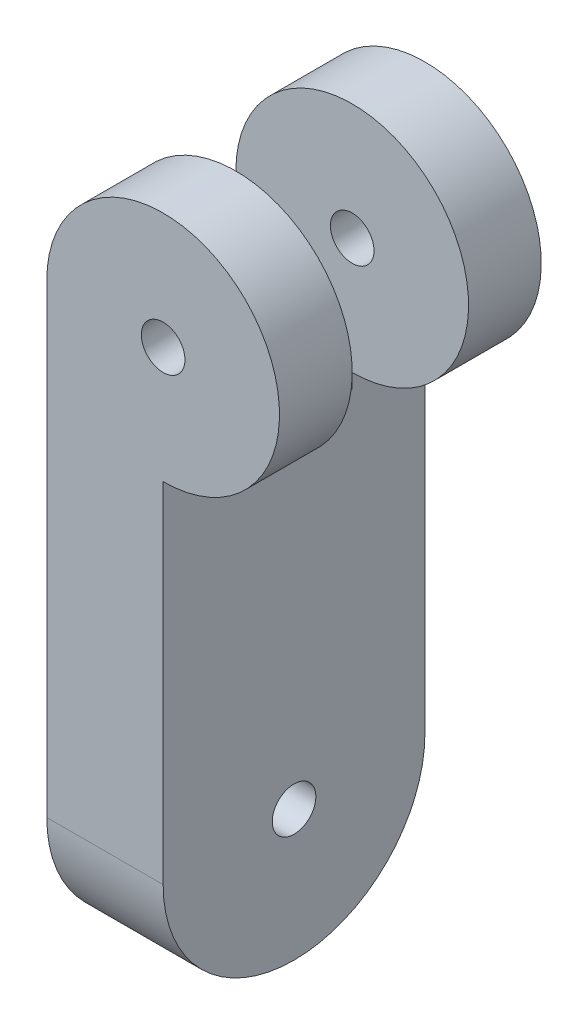
ISO-10303-21;
HEADER;
FILE_DESCRIPTION(('STEP AP214'),'2;1');
FILE_NAME('part.step','',(''),(''),'','','');
FILE_SCHEMA(('AUTOMOTIVE_DESIGN { 1 0 10303 214 1 1 1 1 }'));
ENDSEC;
DATA;
#1=APPLICATION_CONTEXT('core data for automotive mechanical design processes');
#2=APPLICATION_PROTOCOL_DEFINITION('international standard','automotive_design',2000,#1);
#3=PRODUCT_CONTEXT('',#1,'mechanical');
#4=PRODUCT('Part','Part','',(#3));
#5=PRODUCT_RELATED_PRODUCT_CATEGORY('part','',(#4));
#6=PRODUCT_DEFINITION_FORMATION('','',#4);
#7=PRODUCT_DEFINITION_CONTEXT('part definition',#1,'design');
#8=PRODUCT_DEFINITION('design','',#6,#7);
#9=PRODUCT_DEFINITION_SHAPE('','',#8);
#10=(LENGTH_UNIT() NAMED_UNIT(*) SI_UNIT(.MILLI.,.METRE.));
#11=(NAMED_UNIT(*) PLANE_ANGLE_UNIT() SI_UNIT($,.RADIAN.));
#12=(NAMED_UNIT(*) SI_UNIT($,.STERADIAN.) SOLID_ANGLE_UNIT());
#13=UNCERTAINTY_MEASURE_WITH_UNIT(LENGTH_MEASURE(1.E-05),#10,'distance_accuracy_value','');
#14=(GEOMETRIC_REPRESENTATION_CONTEXT(3) GLOBAL_UNCERTAINTY_ASSIGNED_CONTEXT((#13)) GLOBAL_UNIT_ASSIGNED_CONTEXT((#10,
#11,#12)) REPRESENTATION_CONTEXT('',''));
#15=CARTESIAN_POINT('',(0.,0.,0.));
#16=DIRECTION('',(0.,0.,1.));
#17=DIRECTION('',(1.,0.,0.));
#18=AXIS2_PLACEMENT_3D('',#15,#16,#17);
#19=CARTESIAN_POINT('',(0.,0.,0.));
#20=DIRECTION('',(1.,0.,0.));
#21=DIRECTION('',(0.,0.,-1.));
#22=AXIS2_PLACEMENT_3D('',#19,#20,#21);
#23=PLANE('',#22);
#24=CARTESIAN_POINT('',(0.,0.,0.));
#25=DIRECTION('',(1.,0.,0.));
#26=DIRECTION('',(0.,0.,-1.));
#27=AXIS2_PLACEMENT_3D('',#24,#25,#26);
#28=CIRCLE('',#27,3.);
#29=CARTESIAN_POINT('',(0.,0.,-3.));
#30=VERTEX_POINT('',#29);
#31=EDGE_CURVE('E165',#30,#30,#28,.T.);
#32=ORIENTED_EDGE('',*,*,#31,.T.);
#33=EDGE_LOOP('',(#32));
#34=FACE_BOUND('',#33,.T.);
#35=DIRECTION('',(0.,-1.,0.));
#36=VECTOR('',#35,1.);
#37=CARTESIAN_POINT('',(0.,0.,-8.));
#38=LINE('',#37,#36);
#39=CARTESIAN_POINT('',(0.,64.,-8.));
#40=VERTEX_POINT('',#39);
#41=CARTESIAN_POINT('',(0.,55.7537887487647,-8.));
#42=VERTEX_POINT('',#41);
#43=EDGE_CURVE('E116',#40,#42,#38,.T.);
#44=ORIENTED_EDGE('',*,*,#43,.F.);
#45=DIRECTION('',(0.,0.,-1.));
#46=VECTOR('',#45,1.);
#47=CARTESIAN_POINT('',(0.,64.,18.));
#48=LINE('',#47,#46);
#49=CARTESIAN_POINT('',(0.,64.,-18.));
#50=VERTEX_POINT('',#49);
#51=EDGE_CURVE('E147',#40,#50,#48,.T.);
#52=ORIENTED_EDGE('',*,*,#51,.T.);
#53=DIRECTION('',(0.,1.,0.));
#54=VECTOR('',#53,1.);
#55=CARTESIAN_POINT('',(0.,0.,-18.));
#56=LINE('',#55,#54);
#57=CARTESIAN_POINT('',(0.,0.,-18.));
#58=VERTEX_POINT('',#57);
#59=EDGE_CURVE('E190',#58,#50,#56,.T.);
#60=ORIENTED_EDGE('',*,*,#59,.F.);
#61=CARTESIAN_POINT('',(0.,0.,0.));
#62=DIRECTION('',(1.,0.,0.));
#63=DIRECTION('',(0.,0.,-1.));
#64=AXIS2_PLACEMENT_3D('',#61,#62,#63);
#65=CIRCLE('',#64,18.);
#66=CARTESIAN_POINT('',(0.,0.,18.));
#67=VERTEX_POINT('',#66);
#68=EDGE_CURVE('E170',#67,#58,#65,.T.);
#69=ORIENTED_EDGE('',*,*,#68,.F.);
#70=DIRECTION('',(0.,-1.,0.));
#71=VECTOR('',#70,1.);
#72=CARTESIAN_POINT('',(0.,0.,18.));
#73=LINE('',#72,#71);
#74=CARTESIAN_POINT('',(0.,64.,18.));
#75=VERTEX_POINT('',#74);
#76=EDGE_CURVE('E179',#75,#67,#73,.T.);
#77=ORIENTED_EDGE('',*,*,#76,.F.);
#78=CARTESIAN_POINT('',(0.,64.,8.));
#79=VERTEX_POINT('',#78);
#80=EDGE_CURVE('E125',#75,#79,#48,.T.);
#81=ORIENTED_EDGE('',*,*,#80,.T.);
#82=DIRECTION('',(0.,-1.,0.));
#83=VECTOR('',#82,1.);
#84=CARTESIAN_POINT('',(0.,0.,8.));
#85=LINE('',#84,#83);
#86=CARTESIAN_POINT('',(0.,55.7537887487647,8.));
#87=VERTEX_POINT('',#86);
#88=EDGE_CURVE('E54',#79,#87,#85,.T.);
#89=ORIENTED_EDGE('',*,*,#88,.T.);
#90=DIRECTION('',(0.,0.,1.));
#91=VECTOR('',#90,1.);
#92=CARTESIAN_POINT('',(0.,55.7537887487647,-8.));
#93=LINE('',#92,#91);
#94=EDGE_CURVE('E106',#87,#42,#93,.F.);
#95=ORIENTED_EDGE('',*,*,#94,.T.);
#96=EDGE_LOOP('',(#44,#52,#60,#69,#77,#81,#89,#95));
#97=FACE_BOUND('',#96,.T.);
#98=ADVANCED_FACE('F38',(#34,#97),#23,.F.);
#99=CARTESIAN_POINT('',(16.,0.,0.));
#100=DIRECTION('',(1.,0.,0.));
#101=DIRECTION('',(0.,0.,-1.));
#102=AXIS2_PLACEMENT_3D('',#99,#100,#101);
#103=PLANE('',#102);
#104=CARTESIAN_POINT('',(16.,0.,0.));
#105=DIRECTION('',(1.,0.,0.));
#106=DIRECTION('',(0.,0.,-1.));
#107=AXIS2_PLACEMENT_3D('',#104,#105,#106);
#108=CIRCLE('',#107,3.);
#109=CARTESIAN_POINT('',(16.,0.,-3.));
#110=VERTEX_POINT('',#109);
#111=EDGE_CURVE('E166',#110,#110,#108,.T.);
#112=ORIENTED_EDGE('',*,*,#111,.F.);
#113=EDGE_LOOP('',(#112));
#114=FACE_BOUND('',#113,.T.);
#115=DIRECTION('',(0.,0.,-1.));
#116=VECTOR('',#115,1.);
#117=CARTESIAN_POINT('',(16.,48.,18.));
#118=LINE('',#117,#116);
#119=CARTESIAN_POINT('',(16.,48.,-8.));
#120=VERTEX_POINT('',#119);
#121=CARTESIAN_POINT('',(16.,48.,-18.));
#122=VERTEX_POINT('',#121);
#123=EDGE_CURVE('E158',#120,#122,#118,.T.);
#124=ORIENTED_EDGE('',*,*,#123,.F.);
#125=DIRECTION('',(0.,-1.,0.));
#126=VECTOR('',#125,1.);
#127=CARTESIAN_POINT('',(16.,0.,-8.));
#128=LINE('',#127,#126);
#129=CARTESIAN_POINT('',(16.,46.,-8.));
#130=VERTEX_POINT('',#129);
#131=EDGE_CURVE('E139',#120,#130,#128,.T.);
#132=ORIENTED_EDGE('',*,*,#131,.T.);
#133=DIRECTION('',(0.,0.,1.));
#134=VECTOR('',#133,1.);
#135=CARTESIAN_POINT('',(16.,46.,-8.));
#136=LINE('',#135,#134);
#137=CARTESIAN_POINT('',(16.,46.,8.));
#138=VERTEX_POINT('',#137);
#139=EDGE_CURVE('E11',#138,#130,#136,.F.);
#140=ORIENTED_EDGE('',*,*,#139,.F.);
#141=DIRECTION('',(0.,-1.,0.));
#142=VECTOR('',#141,1.);
#143=CARTESIAN_POINT('',(16.,0.,8.));
#144=LINE('',#143,#142);
#145=CARTESIAN_POINT('',(16.,48.,8.));
#146=VERTEX_POINT('',#145);
#147=EDGE_CURVE('E120',#146,#138,#144,.T.);
#148=ORIENTED_EDGE('',*,*,#147,.F.);
#149=CARTESIAN_POINT('',(16.,48.,18.));
#150=VERTEX_POINT('',#149);
#151=EDGE_CURVE('E162',#150,#146,#118,.T.);
#152=ORIENTED_EDGE('',*,*,#151,.F.);
#153=DIRECTION('',(0.,-1.,0.));
#154=VECTOR('',#153,1.);
#155=CARTESIAN_POINT('',(16.,0.,18.));
#156=LINE('',#155,#154);
#157=CARTESIAN_POINT('',(16.,0.,18.));
#158=VERTEX_POINT('',#157);
#159=EDGE_CURVE('E183',#150,#158,#156,.T.);
#160=ORIENTED_EDGE('',*,*,#159,.T.);
#161=CARTESIAN_POINT('',(16.,0.,0.));
#162=DIRECTION('',(1.,0.,0.));
#163=DIRECTION('',(0.,0.,-1.));
#164=AXIS2_PLACEMENT_3D('',#161,#162,#163);
#165=CIRCLE('',#164,18.);
#166=CARTESIAN_POINT('',(16.,0.,-18.));
#167=VERTEX_POINT('',#166);
#168=EDGE_CURVE('E174',#158,#167,#165,.T.);
#169=ORIENTED_EDGE('',*,*,#168,.T.);
#170=DIRECTION('',(0.,1.,0.));
#171=VECTOR('',#170,1.);
#172=CARTESIAN_POINT('',(16.,0.,-18.));
#173=LINE('',#172,#171);
#174=EDGE_CURVE('E178',#167,#122,#173,.T.);
#175=ORIENTED_EDGE('',*,*,#174,.T.);
#176=EDGE_LOOP('',(#124,#132,#140,#148,#152,#160,#169,#175));
#177=FACE_BOUND('',#176,.T.);
#178=ADVANCED_FACE('F215',(#114,#177),#103,.T.);
#179=CARTESIAN_POINT('',(16.,64.,18.));
#180=DIRECTION('',(0.,0.,-1.));
#181=DIRECTION('',(-1.,0.,0.));
#182=AXIS2_PLACEMENT_3D('',#179,#180,#181);
#183=CYLINDRICAL_SURFACE('',#182,16.);
#184=CARTESIAN_POINT('',(16.,64.,-8.));
#185=DIRECTION('',(0.,0.,1.));
#186=DIRECTION('',(1.,0.,0.));
#187=AXIS2_PLACEMENT_3D('',#184,#185,#186);
#188=CIRCLE('',#187,16.);
#189=EDGE_CURVE('E132',#120,#40,#188,.T.);
#190=ORIENTED_EDGE('',*,*,#189,.F.);
#191=ORIENTED_EDGE('',*,*,#123,.T.);
#192=CARTESIAN_POINT('',(16.,64.,-18.));
#193=DIRECTION('',(0.,0.,1.));
#194=DIRECTION('',(-1.,0.,0.));
#195=AXIS2_PLACEMENT_3D('',#192,#193,#194);
#196=CIRCLE('',#195,16.);
#197=EDGE_CURVE('E115',#122,#50,#196,.T.);
#198=ORIENTED_EDGE('',*,*,#197,.T.);
#199=ORIENTED_EDGE('',*,*,#51,.F.);
#200=EDGE_LOOP('',(#190,#191,#198,#199));
#201=FACE_BOUND('',#200,.T.);
#202=ADVANCED_FACE('F222',(#201),#183,.T.);
#203=CARTESIAN_POINT('',(16.,64.,18.));
#204=DIRECTION('',(0.,0.,-1.));
#205=DIRECTION('',(-1.,0.,0.));
#206=AXIS2_PLACEMENT_3D('',#203,#204,#205);
#207=CYLINDRICAL_SURFACE('',#206,3.);
#208=CARTESIAN_POINT('',(16.,64.,-18.));
#209=DIRECTION('',(0.,0.,-1.));
#210=DIRECTION('',(-1.,0.,0.));
#211=AXIS2_PLACEMENT_3D('',#208,#209,#210);
#212=CIRCLE('',#211,3.);
#213=CARTESIAN_POINT('',(13.,64.,-18.));
#214=VERTEX_POINT('',#213);
#215=EDGE_CURVE('E153',#214,#214,#212,.T.);
#216=ORIENTED_EDGE('',*,*,#215,.T.);
#217=EDGE_LOOP('',(#216));
#218=FACE_BOUND('',#217,.T.);
#219=CARTESIAN_POINT('',(16.,64.,-8.));
#220=DIRECTION('',(0.,0.,1.));
#221=DIRECTION('',(1.,0.,0.));
#222=AXIS2_PLACEMENT_3D('',#219,#220,#221);
#223=CIRCLE('',#222,3.);
#224=CARTESIAN_POINT('',(19.,64.,-8.));
#225=VERTEX_POINT('',#224);
#226=EDGE_CURVE('E127',#225,#225,#223,.F.);
#227=ORIENTED_EDGE('',*,*,#226,.F.);
#228=EDGE_LOOP('',(#227));
#229=FACE_BOUND('',#228,.T.);
#230=ADVANCED_FACE('F242',(#218,#229),#207,.F.);
#231=CARTESIAN_POINT('',(16.,0.,0.));
#232=DIRECTION('',(-1.,0.,0.));
#233=DIRECTION('',(0.,0.,1.));
#234=AXIS2_PLACEMENT_3D('',#231,#232,#233);
#235=CYLINDRICAL_SURFACE('',#234,18.);
#236=ORIENTED_EDGE('',*,*,#68,.T.);
#237=DIRECTION('',(-1.,0.,0.));
#238=VECTOR('',#237,1.);
#239=CARTESIAN_POINT('',(16.,0.,-18.));
#240=LINE('',#239,#238);
#241=EDGE_CURVE('E47',#167,#58,#240,.T.);
#242=ORIENTED_EDGE('',*,*,#241,.F.);
#243=ORIENTED_EDGE('',*,*,#168,.F.);
#244=DIRECTION('',(-1.,0.,0.));
#245=VECTOR('',#244,1.);
#246=CARTESIAN_POINT('',(16.,0.,18.));
#247=LINE('',#246,#245);
#248=EDGE_CURVE('E186',#158,#67,#247,.T.);
#249=ORIENTED_EDGE('',*,*,#248,.T.);
#250=EDGE_LOOP('',(#236,#242,#243,#249));
#251=FACE_BOUND('',#250,.T.);
#252=ADVANCED_FACE('F40',(#251),#235,.T.);
#253=CARTESIAN_POINT('',(16.,0.,-18.));
#254=DIRECTION('',(0.,0.,1.));
#255=DIRECTION('',(1.,0.,0.));
#256=AXIS2_PLACEMENT_3D('',#253,#254,#255);
#257=PLANE('',#256);
#258=ORIENTED_EDGE('',*,*,#215,.F.);
#259=EDGE_LOOP('',(#258));
#260=FACE_BOUND('',#259,.T.);
#261=ORIENTED_EDGE('',*,*,#197,.F.);
#262=ORIENTED_EDGE('',*,*,#174,.F.);
#263=ORIENTED_EDGE('',*,*,#241,.T.);
#264=ORIENTED_EDGE('',*,*,#59,.T.);
#265=EDGE_LOOP('',(#261,#262,#263,#264));
#266=FACE_BOUND('',#265,.T.);
#267=ADVANCED_FACE('F224',(#260,#266),#257,.F.);
#268=CARTESIAN_POINT('',(16.,0.,18.));
#269=DIRECTION('',(0.,0.,-1.));
#270=DIRECTION('',(-1.,0.,0.));
#271=AXIS2_PLACEMENT_3D('',#268,#269,#270);
#272=PLANE('',#271);
#273=CARTESIAN_POINT('',(16.,64.,18.));
#274=DIRECTION('',(0.,0.,-1.));
#275=DIRECTION('',(-1.,0.,0.));
#276=AXIS2_PLACEMENT_3D('',#273,#274,#275);
#277=CIRCLE('',#276,3.);
#278=CARTESIAN_POINT('',(13.,64.,18.));
#279=VERTEX_POINT('',#278);
#280=EDGE_CURVE('E154',#279,#279,#277,.T.);
#281=ORIENTED_EDGE('',*,*,#280,.T.);
#282=EDGE_LOOP('',(#281));
#283=FACE_BOUND('',#282,.T.);
#284=ORIENTED_EDGE('',*,*,#159,.F.);
#285=CARTESIAN_POINT('',(16.,64.,18.));
#286=DIRECTION('',(0.,0.,1.));
#287=DIRECTION('',(-1.,0.,0.));
#288=AXIS2_PLACEMENT_3D('',#285,#286,#287);
#289=CIRCLE('',#288,16.);
#290=EDGE_CURVE('E62',#150,#75,#289,.T.);
#291=ORIENTED_EDGE('',*,*,#290,.T.);
#292=ORIENTED_EDGE('',*,*,#76,.T.);
#293=ORIENTED_EDGE('',*,*,#248,.F.);
#294=EDGE_LOOP('',(#284,#291,#292,#293));
#295=FACE_BOUND('',#294,.T.);
#296=ADVANCED_FACE('F231',(#283,#295),#272,.F.);
#297=CARTESIAN_POINT('',(16.,0.,0.));
#298=DIRECTION('',(-1.,0.,0.));
#299=DIRECTION('',(0.,0.,1.));
#300=AXIS2_PLACEMENT_3D('',#297,#298,#299);
#301=CYLINDRICAL_SURFACE('',#300,3.);
#302=ORIENTED_EDGE('',*,*,#111,.T.);
#303=EDGE_LOOP('',(#302));
#304=FACE_BOUND('',#303,.T.);
#305=ORIENTED_EDGE('',*,*,#31,.F.);
#306=EDGE_LOOP('',(#305));
#307=FACE_BOUND('',#306,.T.);
#308=ADVANCED_FACE('F235',(#304,#307),#301,.F.);
#309=ORIENTED_EDGE('',*,*,#151,.T.);
#310=CARTESIAN_POINT('',(16.,64.,8.));
#311=DIRECTION('',(0.,0.,1.));
#312=DIRECTION('',(1.,0.,0.));
#313=AXIS2_PLACEMENT_3D('',#310,#311,#312);
#314=CIRCLE('',#313,16.);
#315=EDGE_CURVE('E133',#146,#79,#314,.T.);
#316=ORIENTED_EDGE('',*,*,#315,.T.);
#317=ORIENTED_EDGE('',*,*,#80,.F.);
#318=ORIENTED_EDGE('',*,*,#290,.F.);
#319=EDGE_LOOP('',(#309,#316,#317,#318));
#320=FACE_BOUND('',#319,.T.);
#321=ADVANCED_FACE('F232',(#320),#183,.T.);
#322=CARTESIAN_POINT('',(16.,64.,8.));
#323=DIRECTION('',(0.,0.,1.));
#324=DIRECTION('',(1.,0.,0.));
#325=AXIS2_PLACEMENT_3D('',#322,#323,#324);
#326=CIRCLE('',#325,3.);
#327=CARTESIAN_POINT('',(19.,64.,8.));
#328=VERTEX_POINT('',#327);
#329=EDGE_CURVE('E202',#328,#328,#326,.F.);
#330=ORIENTED_EDGE('',*,*,#329,.T.);
#331=EDGE_LOOP('',(#330));
#332=FACE_BOUND('',#331,.T.);
#333=ORIENTED_EDGE('',*,*,#280,.F.);
#334=EDGE_LOOP('',(#333));
#335=FACE_BOUND('',#334,.T.);
#336=ADVANCED_FACE('F234',(#332,#335),#207,.F.);
#337=CARTESIAN_POINT('',(16.,64.,-8.));
#338=DIRECTION('',(0.,0.,1.));
#339=DIRECTION('',(1.,0.,0.));
#340=AXIS2_PLACEMENT_3D('',#337,#338,#339);
#341=CYLINDRICAL_SURFACE('',#340,18.);
#342=CARTESIAN_POINT('',(16.,64.,8.));
#343=DIRECTION('',(0.,0.,1.));
#344=DIRECTION('',(1.,0.,0.));
#345=AXIS2_PLACEMENT_3D('',#342,#343,#344);
#346=CIRCLE('',#345,18.);
#347=EDGE_CURVE('E108',#87,#138,#346,.T.);
#348=ORIENTED_EDGE('',*,*,#347,.T.);
#349=ORIENTED_EDGE('',*,*,#139,.T.);
#350=CARTESIAN_POINT('',(16.,64.,-8.));
#351=DIRECTION('',(0.,0.,1.));
#352=DIRECTION('',(1.,0.,0.));
#353=AXIS2_PLACEMENT_3D('',#350,#351,#352);
#354=CIRCLE('',#353,18.);
#355=EDGE_CURVE('E111',#42,#130,#354,.T.);
#356=ORIENTED_EDGE('',*,*,#355,.F.);
#357=ORIENTED_EDGE('',*,*,#94,.F.);
#358=EDGE_LOOP('',(#348,#349,#356,#357));
#359=FACE_BOUND('',#358,.T.);
#360=ADVANCED_FACE('F107',(#359),#341,.F.);
#361=CARTESIAN_POINT('',(16.,64.,-8.));
#362=DIRECTION('',(0.,0.,1.));
#363=DIRECTION('',(1.,0.,0.));
#364=AXIS2_PLACEMENT_3D('',#361,#362,#363);
#365=PLANE('',#364);
#366=ORIENTED_EDGE('',*,*,#226,.T.);
#367=EDGE_LOOP('',(#366));
#368=FACE_BOUND('',#367,.T.);
#369=ORIENTED_EDGE('',*,*,#43,.T.);
#370=ORIENTED_EDGE('',*,*,#355,.T.);
#371=ORIENTED_EDGE('',*,*,#131,.F.);
#372=ORIENTED_EDGE('',*,*,#189,.T.);
#373=EDGE_LOOP('',(#369,#370,#371,#372));
#374=FACE_BOUND('',#373,.T.);
#375=ADVANCED_FACE('F211',(#368,#374),#365,.T.);
#376=CARTESIAN_POINT('',(16.,64.,8.));
#377=DIRECTION('',(0.,0.,1.));
#378=DIRECTION('',(1.,0.,0.));
#379=AXIS2_PLACEMENT_3D('',#376,#377,#378);
#380=PLANE('',#379);
#381=ORIENTED_EDGE('',*,*,#329,.F.);
#382=EDGE_LOOP('',(#381));
#383=FACE_BOUND('',#382,.T.);
#384=ORIENTED_EDGE('',*,*,#315,.F.);
#385=ORIENTED_EDGE('',*,*,#147,.T.);
#386=ORIENTED_EDGE('',*,*,#347,.F.);
#387=ORIENTED_EDGE('',*,*,#88,.F.);
#388=EDGE_LOOP('',(#384,#385,#386,#387));
#389=FACE_BOUND('',#388,.T.);
#390=ADVANCED_FACE('F118',(#383,#389),#380,.F.);
#391=CLOSED_SHELL('',(#98,#178,#202,#230,#252,#267,#296,#308,#321,#336,#360,#375,#390));
#392=MANIFOLD_SOLID_BREP('B2',#391);
#393=ADVANCED_BREP_SHAPE_REPRESENTATION('',(#18,#392),#14);
#394=SHAPE_DEFINITION_REPRESENTATION(#9,#393);
ENDSEC;
END-ISO-10303-21;
